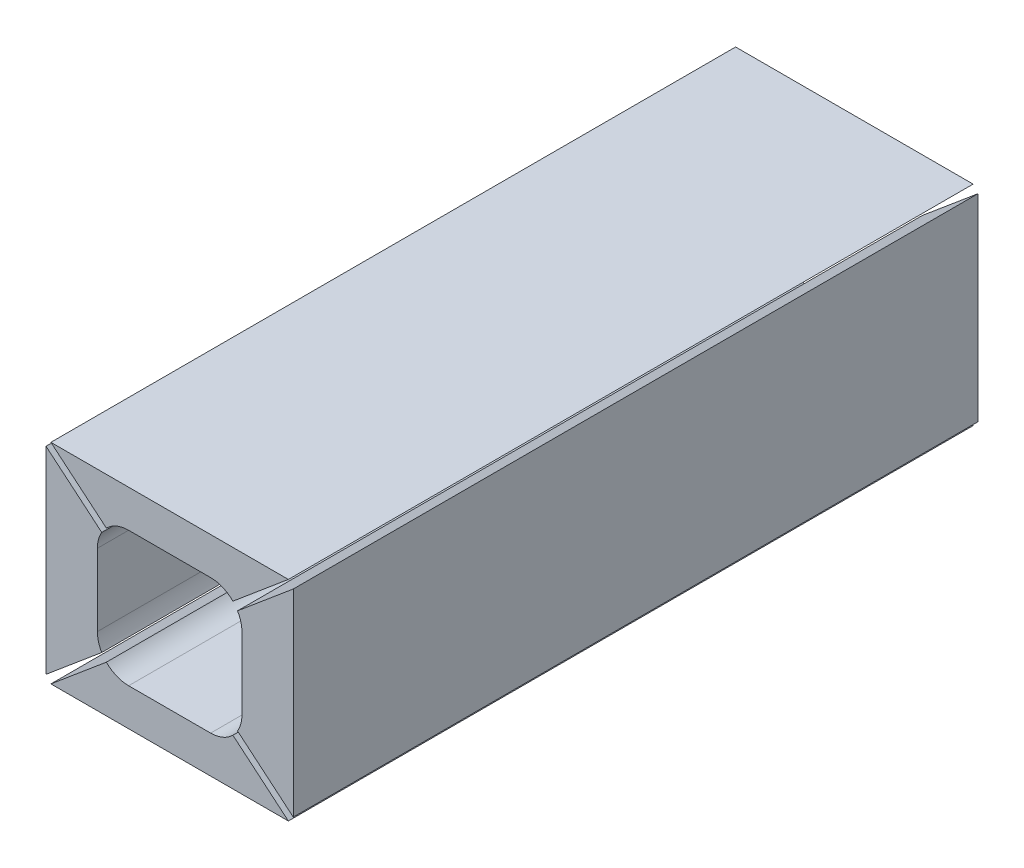
ISO-10303-21;
HEADER;
FILE_DESCRIPTION(('STEP AP214'),'2;1');
FILE_NAME('part.step','',(''),(''),'','','');
FILE_SCHEMA(('AUTOMOTIVE_DESIGN { 1 0 10303 214 1 1 1 1 }'));
ENDSEC;
DATA;
#1=APPLICATION_CONTEXT('core data for automotive mechanical design processes');
#2=APPLICATION_PROTOCOL_DEFINITION('international standard','automotive_design',2000,#1);
#3=PRODUCT_CONTEXT('',#1,'mechanical');
#4=PRODUCT('Part','Part','',(#3));
#5=PRODUCT_RELATED_PRODUCT_CATEGORY('part','',(#4));
#6=PRODUCT_DEFINITION_FORMATION('','',#4);
#7=PRODUCT_DEFINITION_CONTEXT('part definition',#1,'design');
#8=PRODUCT_DEFINITION('design','',#6,#7);
#9=PRODUCT_DEFINITION_SHAPE('','',#8);
#10=(LENGTH_UNIT() NAMED_UNIT(*) SI_UNIT(.MILLI.,.METRE.));
#11=(NAMED_UNIT(*) PLANE_ANGLE_UNIT() SI_UNIT($,.RADIAN.));
#12=(NAMED_UNIT(*) SI_UNIT($,.STERADIAN.) SOLID_ANGLE_UNIT());
#13=UNCERTAINTY_MEASURE_WITH_UNIT(LENGTH_MEASURE(1.E-05),#10,'distance_accuracy_value','');
#14=(GEOMETRIC_REPRESENTATION_CONTEXT(3) GLOBAL_UNCERTAINTY_ASSIGNED_CONTEXT((#13)) GLOBAL_UNIT_ASSIGNED_CONTEXT((#10,
#11,#12)) REPRESENTATION_CONTEXT('',''));
#15=CARTESIAN_POINT('',(0.,0.,0.));
#16=DIRECTION('',(0.,0.,1.));
#17=DIRECTION('',(1.,0.,0.));
#18=AXIS2_PLACEMENT_3D('',#15,#16,#17);
#19=CARTESIAN_POINT('',(10.78,-9.48,90.));
#20=DIRECTION('',(0.,0.,-1.));
#21=DIRECTION('',(-1.,0.,0.));
#22=AXIS2_PLACEMENT_3D('',#19,#20,#21);
#23=CYLINDRICAL_SURFACE('',#22,8.22);
#24=CARTESIAN_POINT('',(10.78,-9.48,-90.));
#25=DIRECTION('',(0.,0.,-1.));
#26=DIRECTION('',(1.,0.,0.));
#27=AXIS2_PLACEMENT_3D('',#24,#25,#26);
#28=CIRCLE('',#27,8.22);
#29=CARTESIAN_POINT('',(16.6272763873485,-15.257348773439,-90.));
#30=VERTEX_POINT('',#29);
#31=CARTESIAN_POINT('',(10.78,-17.7,-90.));
#32=VERTEX_POINT('',#31);
#33=EDGE_CURVE('E128',#30,#32,#28,.T.);
#34=ORIENTED_EDGE('',*,*,#33,.T.);
#35=DIRECTION('',(0.,0.,-1.));
#36=VECTOR('',#35,1.);
#37=CARTESIAN_POINT('',(10.78,-17.7,90.));
#38=LINE('',#37,#36);
#39=CARTESIAN_POINT('',(10.78,-17.7,90.));
#40=VERTEX_POINT('',#39);
#41=EDGE_CURVE('E12',#40,#32,#38,.T.);
#42=ORIENTED_EDGE('',*,*,#41,.F.);
#43=CARTESIAN_POINT('',(10.78,-9.48,90.));
#44=DIRECTION('',(0.,0.,-1.));
#45=DIRECTION('',(1.,0.,0.));
#46=AXIS2_PLACEMENT_3D('',#43,#44,#45);
#47=CIRCLE('',#46,8.22);
#48=CARTESIAN_POINT('',(16.6272763873485,-15.257348773439,90.));
#49=VERTEX_POINT('',#48);
#50=EDGE_CURVE('E138',#49,#40,#47,.T.);
#51=ORIENTED_EDGE('',*,*,#50,.F.);
#52=DIRECTION('',(0.,0.,-1.));
#53=VECTOR('',#52,1.);
#54=CARTESIAN_POINT('',(16.6272763873485,-15.257348773439,90.));
#55=LINE('',#54,#53);
#56=EDGE_CURVE('E124',#49,#30,#55,.T.);
#57=ORIENTED_EDGE('',*,*,#56,.T.);
#58=EDGE_LOOP('',(#34,#42,#51,#57));
#59=FACE_BOUND('',#58,.T.);
#60=ADVANCED_FACE('F44',(#59),#23,.F.);
#61=CARTESIAN_POINT('',(10.78,-17.7,90.));
#62=DIRECTION('',(0.,-1.,0.));
#63=DIRECTION('',(0.,0.,-1.));
#64=AXIS2_PLACEMENT_3D('',#61,#62,#63);
#65=PLANE('',#64);
#66=DIRECTION('',(-1.,0.,0.));
#67=VECTOR('',#66,1.);
#68=CARTESIAN_POINT('',(10.78,-17.7,-90.));
#69=LINE('',#68,#67);
#70=CARTESIAN_POINT('',(-10.78,-17.7,-90.));
#71=VERTEX_POINT('',#70);
#72=EDGE_CURVE('E131',#32,#71,#69,.T.);
#73=ORIENTED_EDGE('',*,*,#72,.T.);
#74=DIRECTION('',(0.,0.,-1.));
#75=VECTOR('',#74,1.);
#76=CARTESIAN_POINT('',(-10.78,-17.7,90.));
#77=LINE('',#76,#75);
#78=CARTESIAN_POINT('',(-10.78,-17.7,90.));
#79=VERTEX_POINT('',#78);
#80=EDGE_CURVE('E52',#79,#71,#77,.T.);
#81=ORIENTED_EDGE('',*,*,#80,.F.);
#82=DIRECTION('',(-1.,0.,0.));
#83=VECTOR('',#82,1.);
#84=CARTESIAN_POINT('',(10.78,-17.7,90.));
#85=LINE('',#84,#83);
#86=EDGE_CURVE('E97',#40,#79,#85,.T.);
#87=ORIENTED_EDGE('',*,*,#86,.F.);
#88=ORIENTED_EDGE('',*,*,#41,.T.);
#89=EDGE_LOOP('',(#73,#81,#87,#88));
#90=FACE_BOUND('',#89,.T.);
#91=ADVANCED_FACE('F162',(#90),#65,.F.);
#92=CARTESIAN_POINT('',(-10.78,-9.48,90.));
#93=DIRECTION('',(0.,0.,-1.));
#94=DIRECTION('',(-1.,0.,0.));
#95=AXIS2_PLACEMENT_3D('',#92,#93,#94);
#96=CYLINDRICAL_SURFACE('',#95,8.22);
#97=CARTESIAN_POINT('',(-10.78,-9.48,-90.));
#98=DIRECTION('',(0.,0.,-1.));
#99=DIRECTION('',(-1.,0.,0.));
#100=AXIS2_PLACEMENT_3D('',#97,#98,#99);
#101=CIRCLE('',#100,8.22);
#102=CARTESIAN_POINT('',(-16.6272763873484,-15.257348773439,-90.));
#103=VERTEX_POINT('',#102);
#104=EDGE_CURVE('E133',#71,#103,#101,.T.);
#105=ORIENTED_EDGE('',*,*,#104,.T.);
#106=DIRECTION('',(0.,0.,-1.));
#107=VECTOR('',#106,1.);
#108=CARTESIAN_POINT('',(-16.6272763873484,-15.257348773439,90.));
#109=LINE('',#108,#107);
#110=CARTESIAN_POINT('',(-16.6272763873484,-15.257348773439,90.));
#111=VERTEX_POINT('',#110);
#112=EDGE_CURVE('E119',#111,#103,#109,.T.);
#113=ORIENTED_EDGE('',*,*,#112,.F.);
#114=CARTESIAN_POINT('',(-10.78,-9.48,90.));
#115=DIRECTION('',(0.,0.,-1.));
#116=DIRECTION('',(-1.,0.,0.));
#117=AXIS2_PLACEMENT_3D('',#114,#115,#116);
#118=CIRCLE('',#117,8.22);
#119=EDGE_CURVE('E110',#79,#111,#118,.T.);
#120=ORIENTED_EDGE('',*,*,#119,.F.);
#121=ORIENTED_EDGE('',*,*,#80,.T.);
#122=EDGE_LOOP('',(#105,#113,#120,#121));
#123=FACE_BOUND('',#122,.T.);
#124=ADVANCED_FACE('F144',(#123),#96,.F.);
#125=CARTESIAN_POINT('',(-16.6272763873484,-15.257348773439,90.));
#126=DIRECTION('',(0.642787609686538,-0.766044443118979,0.));
#127=DIRECTION('',(0.766044443118979,0.642787609686538,0.));
#128=AXIS2_PLACEMENT_3D('',#125,#126,#127);
#129=PLANE('',#128);
#130=DIRECTION('',(-0.766044443118979,-0.642787609686538,0.));
#131=VECTOR('',#130,1.);
#132=CARTESIAN_POINT('',(-16.6272763873484,-15.257348773439,-90.));
#133=LINE('',#132,#131);
#134=CARTESIAN_POINT('',(-31.2174999694805,-27.5,-90.));
#135=VERTEX_POINT('',#134);
#136=EDGE_CURVE('E118',#103,#135,#133,.T.);
#137=ORIENTED_EDGE('',*,*,#136,.T.);
#138=DIRECTION('',(0.,0.,-1.));
#139=VECTOR('',#138,1.);
#140=CARTESIAN_POINT('',(-31.2174999694805,-27.5,90.));
#141=LINE('',#140,#139);
#142=CARTESIAN_POINT('',(-31.2174999694805,-27.5,90.));
#143=VERTEX_POINT('',#142);
#144=EDGE_CURVE('E115',#143,#135,#141,.T.);
#145=ORIENTED_EDGE('',*,*,#144,.F.);
#146=DIRECTION('',(-0.766044443118979,-0.642787609686538,0.));
#147=VECTOR('',#146,1.);
#148=CARTESIAN_POINT('',(-16.6272763873484,-15.257348773439,90.));
#149=LINE('',#148,#147);
#150=EDGE_CURVE('E104',#111,#143,#149,.T.);
#151=ORIENTED_EDGE('',*,*,#150,.F.);
#152=ORIENTED_EDGE('',*,*,#112,.T.);
#153=EDGE_LOOP('',(#137,#145,#151,#152));
#154=FACE_BOUND('',#153,.T.);
#155=ADVANCED_FACE('F116',(#154),#129,.F.);
#156=CARTESIAN_POINT('',(31.2174999694805,-27.5,90.));
#157=DIRECTION('',(0.,1.,0.));
#158=DIRECTION('',(-1.,0.,0.));
#159=AXIS2_PLACEMENT_3D('',#156,#157,#158);
#160=PLANE('',#159);
#161=DIRECTION('',(1.,0.,0.));
#162=VECTOR('',#161,1.);
#163=CARTESIAN_POINT('',(31.2174999694805,-27.5,-90.));
#164=LINE('',#163,#162);
#165=CARTESIAN_POINT('',(31.2174999694805,-27.5,-90.));
#166=VERTEX_POINT('',#165);
#167=EDGE_CURVE('E83',#135,#166,#164,.T.);
#168=ORIENTED_EDGE('',*,*,#167,.T.);
#169=DIRECTION('',(0.,0.,-1.));
#170=VECTOR('',#169,1.);
#171=CARTESIAN_POINT('',(31.2174999694805,-27.5,90.));
#172=LINE('',#171,#170);
#173=CARTESIAN_POINT('',(31.2174999694805,-27.5,90.));
#174=VERTEX_POINT('',#173);
#175=EDGE_CURVE('E120',#174,#166,#172,.T.);
#176=ORIENTED_EDGE('',*,*,#175,.F.);
#177=DIRECTION('',(1.,0.,0.));
#178=VECTOR('',#177,1.);
#179=CARTESIAN_POINT('',(31.2174999694805,-27.5,90.));
#180=LINE('',#179,#178);
#181=EDGE_CURVE('E108',#143,#174,#180,.T.);
#182=ORIENTED_EDGE('',*,*,#181,.F.);
#183=ORIENTED_EDGE('',*,*,#144,.T.);
#184=EDGE_LOOP('',(#168,#176,#182,#183));
#185=FACE_BOUND('',#184,.T.);
#186=ADVANCED_FACE('F122',(#185),#160,.F.);
#187=CARTESIAN_POINT('',(16.6272763873485,-15.257348773439,90.));
#188=DIRECTION('',(-0.642787609686538,-0.766044443118979,0.));
#189=DIRECTION('',(0.766044443118979,-0.642787609686538,0.));
#190=AXIS2_PLACEMENT_3D('',#187,#188,#189);
#191=PLANE('',#190);
#192=DIRECTION('',(-0.766044443118979,0.642787609686538,0.));
#193=VECTOR('',#192,1.);
#194=CARTESIAN_POINT('',(16.6272763873485,-15.257348773439,-90.));
#195=LINE('',#194,#193);
#196=EDGE_CURVE('E89',#166,#30,#195,.T.);
#197=ORIENTED_EDGE('',*,*,#196,.T.);
#198=ORIENTED_EDGE('',*,*,#56,.F.);
#199=DIRECTION('',(-0.766044443118979,0.642787609686538,0.));
#200=VECTOR('',#199,1.);
#201=CARTESIAN_POINT('',(16.6272763873485,-15.257348773439,90.));
#202=LINE('',#201,#200);
#203=EDGE_CURVE('E60',#174,#49,#202,.T.);
#204=ORIENTED_EDGE('',*,*,#203,.F.);
#205=ORIENTED_EDGE('',*,*,#175,.T.);
#206=EDGE_LOOP('',(#197,#198,#204,#205));
#207=FACE_BOUND('',#206,.T.);
#208=ADVANCED_FACE('F151',(#207),#191,.F.);
#209=CARTESIAN_POINT('',(10.78,-9.48,90.));
#210=DIRECTION('',(0.,0.,1.));
#211=DIRECTION('',(1.,0.,0.));
#212=AXIS2_PLACEMENT_3D('',#209,#210,#211);
#213=PLANE('',#212);
#214=ORIENTED_EDGE('',*,*,#50,.T.);
#215=ORIENTED_EDGE('',*,*,#86,.T.);
#216=ORIENTED_EDGE('',*,*,#119,.T.);
#217=ORIENTED_EDGE('',*,*,#150,.T.);
#218=ORIENTED_EDGE('',*,*,#181,.T.);
#219=ORIENTED_EDGE('',*,*,#203,.T.);
#220=EDGE_LOOP('',(#214,#215,#216,#217,#218,#219));
#221=FACE_BOUND('',#220,.T.);
#222=ADVANCED_FACE('F106',(#221),#213,.T.);
#223=CARTESIAN_POINT('',(10.78,-9.48,-90.));
#224=DIRECTION('',(0.,0.,1.));
#225=DIRECTION('',(1.,0.,0.));
#226=AXIS2_PLACEMENT_3D('',#223,#224,#225);
#227=PLANE('',#226);
#228=ORIENTED_EDGE('',*,*,#33,.F.);
#229=ORIENTED_EDGE('',*,*,#196,.F.);
#230=ORIENTED_EDGE('',*,*,#167,.F.);
#231=ORIENTED_EDGE('',*,*,#136,.F.);
#232=ORIENTED_EDGE('',*,*,#104,.F.);
#233=ORIENTED_EDGE('',*,*,#72,.F.);
#234=EDGE_LOOP('',(#228,#229,#230,#231,#232,#233));
#235=FACE_BOUND('',#234,.T.);
#236=ADVANCED_FACE('F147',(#235),#227,.F.);
#237=CLOSED_SHELL('',(#60,#91,#124,#155,#186,#208,#222,#236));
#238=MANIFOLD_SOLID_BREP('B2',#237);
#239=CARTESIAN_POINT('',(-17.8502959238137,-13.672769436745,90.));
#240=DIRECTION('',(-0.642787609686538,0.766044443118979,0.));
#241=DIRECTION('',(-0.766044443118979,-0.642787609686538,0.));
#242=AXIS2_PLACEMENT_3D('',#239,#240,#241);
#243=PLANE('',#242);
#244=DIRECTION('',(0.766044443118979,0.642787609686538,0.));
#245=VECTOR('',#244,1.);
#246=CARTESIAN_POINT('',(-17.8502959238137,-13.672769436745,-90.));
#247=LINE('',#246,#245);
#248=CARTESIAN_POINT('',(-32.5,-25.9653307239292,-90.));
#249=VERTEX_POINT('',#248);
#250=CARTESIAN_POINT('',(-17.8502959238137,-13.672769436745,-90.));
#251=VERTEX_POINT('',#250);
#252=EDGE_CURVE('E314',#249,#251,#247,.T.);
#253=ORIENTED_EDGE('',*,*,#252,.T.);
#254=DIRECTION('',(0.,0.,-1.));
#255=VECTOR('',#254,1.);
#256=CARTESIAN_POINT('',(-17.8502959238137,-13.672769436745,90.));
#257=LINE('',#256,#255);
#258=CARTESIAN_POINT('',(-17.8502959238137,-13.672769436745,90.));
#259=VERTEX_POINT('',#258);
#260=EDGE_CURVE('E42',#259,#251,#257,.T.);
#261=ORIENTED_EDGE('',*,*,#260,.F.);
#262=DIRECTION('',(0.766044443118979,0.642787609686538,0.));
#263=VECTOR('',#262,1.);
#264=CARTESIAN_POINT('',(-17.8502959238137,-13.672769436745,90.));
#265=LINE('',#264,#263);
#266=CARTESIAN_POINT('',(-32.5,-25.9653307239292,90.));
#267=VERTEX_POINT('',#266);
#268=EDGE_CURVE('E324',#267,#259,#265,.T.);
#269=ORIENTED_EDGE('',*,*,#268,.F.);
#270=DIRECTION('',(0.,0.,-1.));
#271=VECTOR('',#270,1.);
#272=CARTESIAN_POINT('',(-32.5,-25.9653307239292,90.));
#273=LINE('',#272,#271);
#274=EDGE_CURVE('E310',#267,#249,#273,.T.);
#275=ORIENTED_EDGE('',*,*,#274,.T.);
#276=EDGE_LOOP('',(#253,#261,#269,#275));
#277=FACE_BOUND('',#276,.T.);
#278=ADVANCED_FACE('F230',(#277),#243,.F.);
#279=CARTESIAN_POINT('',(-10.78,-9.48,90.));
#280=DIRECTION('',(0.,0.,-1.));
#281=DIRECTION('',(-1.,0.,0.));
#282=AXIS2_PLACEMENT_3D('',#279,#280,#281);
#283=CYLINDRICAL_SURFACE('',#282,8.22000000000001);
#284=CARTESIAN_POINT('',(-10.78,-9.48,-90.));
#285=DIRECTION('',(0.,0.,-1.));
#286=DIRECTION('',(-1.,0.,0.));
#287=AXIS2_PLACEMENT_3D('',#284,#285,#286);
#288=CIRCLE('',#287,8.22000000000001);
#289=CARTESIAN_POINT('',(-19.,-9.48,-90.));
#290=VERTEX_POINT('',#289);
#291=EDGE_CURVE('E317',#251,#290,#288,.T.);
#292=ORIENTED_EDGE('',*,*,#291,.T.);
#293=DIRECTION('',(0.,0.,-1.));
#294=VECTOR('',#293,1.);
#295=CARTESIAN_POINT('',(-19.,-9.48,90.));
#296=LINE('',#295,#294);
#297=CARTESIAN_POINT('',(-19.,-9.48,90.));
#298=VERTEX_POINT('',#297);
#299=EDGE_CURVE('E238',#298,#290,#296,.T.);
#300=ORIENTED_EDGE('',*,*,#299,.F.);
#301=CARTESIAN_POINT('',(-10.78,-9.48,90.));
#302=DIRECTION('',(0.,0.,-1.));
#303=DIRECTION('',(-1.,0.,0.));
#304=AXIS2_PLACEMENT_3D('',#301,#302,#303);
#305=CIRCLE('',#304,8.22000000000001);
#306=EDGE_CURVE('E283',#259,#298,#305,.T.);
#307=ORIENTED_EDGE('',*,*,#306,.F.);
#308=ORIENTED_EDGE('',*,*,#260,.T.);
#309=EDGE_LOOP('',(#292,#300,#307,#308));
#310=FACE_BOUND('',#309,.T.);
#311=ADVANCED_FACE('F348',(#310),#283,.F.);
#312=CARTESIAN_POINT('',(-19.,-9.48,90.));
#313=DIRECTION('',(-1.,0.,0.));
#314=DIRECTION('',(0.,0.,1.));
#315=AXIS2_PLACEMENT_3D('',#312,#313,#314);
#316=PLANE('',#315);
#317=DIRECTION('',(0.,1.,0.));
#318=VECTOR('',#317,1.);
#319=CARTESIAN_POINT('',(-19.,-9.48,-90.));
#320=LINE('',#319,#318);
#321=CARTESIAN_POINT('',(-19.,9.48,-90.));
#322=VERTEX_POINT('',#321);
#323=EDGE_CURVE('E319',#290,#322,#320,.T.);
#324=ORIENTED_EDGE('',*,*,#323,.T.);
#325=DIRECTION('',(0.,0.,-1.));
#326=VECTOR('',#325,1.);
#327=CARTESIAN_POINT('',(-19.,9.48,90.));
#328=LINE('',#327,#326);
#329=CARTESIAN_POINT('',(-19.,9.48,90.));
#330=VERTEX_POINT('',#329);
#331=EDGE_CURVE('E305',#330,#322,#328,.T.);
#332=ORIENTED_EDGE('',*,*,#331,.F.);
#333=DIRECTION('',(0.,1.,0.));
#334=VECTOR('',#333,1.);
#335=CARTESIAN_POINT('',(-19.,-9.48,90.));
#336=LINE('',#335,#334);
#337=EDGE_CURVE('E296',#298,#330,#336,.T.);
#338=ORIENTED_EDGE('',*,*,#337,.F.);
#339=ORIENTED_EDGE('',*,*,#299,.T.);
#340=EDGE_LOOP('',(#324,#332,#338,#339));
#341=FACE_BOUND('',#340,.T.);
#342=ADVANCED_FACE('F330',(#341),#316,.F.);
#343=CARTESIAN_POINT('',(-10.78,9.48,90.));
#344=DIRECTION('',(0.,0.,-1.));
#345=DIRECTION('',(-1.,0.,0.));
#346=AXIS2_PLACEMENT_3D('',#343,#344,#345);
#347=CYLINDRICAL_SURFACE('',#346,8.22);
#348=CARTESIAN_POINT('',(-10.78,9.48,-90.));
#349=DIRECTION('',(0.,0.,-1.));
#350=DIRECTION('',(1.,0.,0.));
#351=AXIS2_PLACEMENT_3D('',#348,#349,#350);
#352=CIRCLE('',#351,8.22);
#353=CARTESIAN_POINT('',(-17.8502959238137,13.672769436745,-90.));
#354=VERTEX_POINT('',#353);
#355=EDGE_CURVE('E304',#322,#354,#352,.T.);
#356=ORIENTED_EDGE('',*,*,#355,.T.);
#357=DIRECTION('',(0.,0.,-1.));
#358=VECTOR('',#357,1.);
#359=CARTESIAN_POINT('',(-17.8502959238137,13.672769436745,90.));
#360=LINE('',#359,#358);
#361=CARTESIAN_POINT('',(-17.8502959238137,13.672769436745,90.));
#362=VERTEX_POINT('',#361);
#363=EDGE_CURVE('E301',#362,#354,#360,.T.);
#364=ORIENTED_EDGE('',*,*,#363,.F.);
#365=CARTESIAN_POINT('',(-10.78,9.48,90.));
#366=DIRECTION('',(0.,0.,-1.));
#367=DIRECTION('',(1.,0.,0.));
#368=AXIS2_PLACEMENT_3D('',#365,#366,#367);
#369=CIRCLE('',#368,8.22);
#370=EDGE_CURVE('E290',#330,#362,#369,.T.);
#371=ORIENTED_EDGE('',*,*,#370,.F.);
#372=ORIENTED_EDGE('',*,*,#331,.T.);
#373=EDGE_LOOP('',(#356,#364,#371,#372));
#374=FACE_BOUND('',#373,.T.);
#375=ADVANCED_FACE('F302',(#374),#347,.F.);
#376=CARTESIAN_POINT('',(-17.8502959238137,13.672769436745,90.));
#377=DIRECTION('',(-0.642787609686538,-0.766044443118979,0.));
#378=DIRECTION('',(0.766044443118979,-0.642787609686538,0.));
#379=AXIS2_PLACEMENT_3D('',#376,#377,#378);
#380=PLANE('',#379);
#381=DIRECTION('',(-0.766044443118979,0.642787609686538,0.));
#382=VECTOR('',#381,1.);
#383=CARTESIAN_POINT('',(-17.8502959238137,13.672769436745,-90.));
#384=LINE('',#383,#382);
#385=CARTESIAN_POINT('',(-32.5,25.9653307239292,-90.));
#386=VERTEX_POINT('',#385);
#387=EDGE_CURVE('E269',#354,#386,#384,.T.);
#388=ORIENTED_EDGE('',*,*,#387,.T.);
#389=DIRECTION('',(0.,0.,-1.));
#390=VECTOR('',#389,1.);
#391=CARTESIAN_POINT('',(-32.5,25.9653307239292,90.));
#392=LINE('',#391,#390);
#393=CARTESIAN_POINT('',(-32.5,25.9653307239292,90.));
#394=VERTEX_POINT('',#393);
#395=EDGE_CURVE('E306',#394,#386,#392,.T.);
#396=ORIENTED_EDGE('',*,*,#395,.F.);
#397=DIRECTION('',(-0.766044443118979,0.642787609686538,0.));
#398=VECTOR('',#397,1.);
#399=CARTESIAN_POINT('',(-17.8502959238137,13.672769436745,90.));
#400=LINE('',#399,#398);
#401=EDGE_CURVE('E294',#362,#394,#400,.T.);
#402=ORIENTED_EDGE('',*,*,#401,.F.);
#403=ORIENTED_EDGE('',*,*,#363,.T.);
#404=EDGE_LOOP('',(#388,#396,#402,#403));
#405=FACE_BOUND('',#404,.T.);
#406=ADVANCED_FACE('F308',(#405),#380,.F.);
#407=CARTESIAN_POINT('',(-32.5,-25.9653307239292,90.));
#408=DIRECTION('',(1.,0.,0.));
#409=DIRECTION('',(0.,0.,-1.));
#410=AXIS2_PLACEMENT_3D('',#407,#408,#409);
#411=PLANE('',#410);
#412=DIRECTION('',(0.,-1.,0.));
#413=VECTOR('',#412,1.);
#414=CARTESIAN_POINT('',(-32.5,-25.9653307239292,-90.));
#415=LINE('',#414,#413);
#416=EDGE_CURVE('E275',#386,#249,#415,.T.);
#417=ORIENTED_EDGE('',*,*,#416,.T.);
#418=ORIENTED_EDGE('',*,*,#274,.F.);
#419=DIRECTION('',(0.,-1.,0.));
#420=VECTOR('',#419,1.);
#421=CARTESIAN_POINT('',(-32.5,-25.9653307239292,90.));
#422=LINE('',#421,#420);
#423=EDGE_CURVE('E246',#394,#267,#422,.T.);
#424=ORIENTED_EDGE('',*,*,#423,.F.);
#425=ORIENTED_EDGE('',*,*,#395,.T.);
#426=EDGE_LOOP('',(#417,#418,#424,#425));
#427=FACE_BOUND('',#426,.T.);
#428=ADVANCED_FACE('F337',(#427),#411,.F.);
#429=CARTESIAN_POINT('',(-10.78,9.48,90.));
#430=DIRECTION('',(0.,0.,1.));
#431=DIRECTION('',(1.,0.,0.));
#432=AXIS2_PLACEMENT_3D('',#429,#430,#431);
#433=PLANE('',#432);
#434=ORIENTED_EDGE('',*,*,#268,.T.);
#435=ORIENTED_EDGE('',*,*,#306,.T.);
#436=ORIENTED_EDGE('',*,*,#337,.T.);
#437=ORIENTED_EDGE('',*,*,#370,.T.);
#438=ORIENTED_EDGE('',*,*,#401,.T.);
#439=ORIENTED_EDGE('',*,*,#423,.T.);
#440=EDGE_LOOP('',(#434,#435,#436,#437,#438,#439));
#441=FACE_BOUND('',#440,.T.);
#442=ADVANCED_FACE('F292',(#441),#433,.T.);
#443=CARTESIAN_POINT('',(-10.78,9.48,-90.));
#444=DIRECTION('',(0.,0.,1.));
#445=DIRECTION('',(1.,0.,0.));
#446=AXIS2_PLACEMENT_3D('',#443,#444,#445);
#447=PLANE('',#446);
#448=ORIENTED_EDGE('',*,*,#252,.F.);
#449=ORIENTED_EDGE('',*,*,#416,.F.);
#450=ORIENTED_EDGE('',*,*,#387,.F.);
#451=ORIENTED_EDGE('',*,*,#355,.F.);
#452=ORIENTED_EDGE('',*,*,#323,.F.);
#453=ORIENTED_EDGE('',*,*,#291,.F.);
#454=EDGE_LOOP('',(#448,#449,#450,#451,#452,#453));
#455=FACE_BOUND('',#454,.T.);
#456=ADVANCED_FACE('F333',(#455),#447,.F.);
#457=CLOSED_SHELL('',(#278,#311,#342,#375,#406,#428,#442,#456));
#458=MANIFOLD_SOLID_BREP('B6',#457);
#459=CARTESIAN_POINT('',(10.78,9.48,90.));
#460=DIRECTION('',(0.,0.,-1.));
#461=DIRECTION('',(-1.,0.,0.));
#462=AXIS2_PLACEMENT_3D('',#459,#460,#461);
#463=CYLINDRICAL_SURFACE('',#462,8.22);
#464=CARTESIAN_POINT('',(10.78,9.48,-90.));
#465=DIRECTION('',(0.,0.,-1.));
#466=DIRECTION('',(-1.,0.,0.));
#467=AXIS2_PLACEMENT_3D('',#464,#465,#466);
#468=CIRCLE('',#467,8.22);
#469=CARTESIAN_POINT('',(17.8502959238137,13.672769436745,-90.));
#470=VERTEX_POINT('',#469);
#471=CARTESIAN_POINT('',(19.,9.48,-90.));
#472=VERTEX_POINT('',#471);
#473=EDGE_CURVE('E499',#470,#472,#468,.T.);
#474=ORIENTED_EDGE('',*,*,#473,.T.);
#475=DIRECTION('',(0.,0.,-1.));
#476=VECTOR('',#475,1.);
#477=CARTESIAN_POINT('',(19.,9.48,90.));
#478=LINE('',#477,#476);
#479=CARTESIAN_POINT('',(19.,9.48,90.));
#480=VERTEX_POINT('',#479);
#481=EDGE_CURVE('E228',#480,#472,#478,.T.);
#482=ORIENTED_EDGE('',*,*,#481,.F.);
#483=CARTESIAN_POINT('',(10.78,9.48,90.));
#484=DIRECTION('',(0.,0.,-1.));
#485=DIRECTION('',(-1.,0.,0.));
#486=AXIS2_PLACEMENT_3D('',#483,#484,#485);
#487=CIRCLE('',#486,8.22);
#488=CARTESIAN_POINT('',(17.8502959238137,13.672769436745,90.));
#489=VERTEX_POINT('',#488);
#490=EDGE_CURVE('E509',#489,#480,#487,.T.);
#491=ORIENTED_EDGE('',*,*,#490,.F.);
#492=DIRECTION('',(0.,0.,-1.));
#493=VECTOR('',#492,1.);
#494=CARTESIAN_POINT('',(17.8502959238137,13.672769436745,90.));
#495=LINE('',#494,#493);
#496=EDGE_CURVE('E495',#489,#470,#495,.T.);
#497=ORIENTED_EDGE('',*,*,#496,.T.);
#498=EDGE_LOOP('',(#474,#482,#491,#497));
#499=FACE_BOUND('',#498,.T.);
#500=ADVANCED_FACE('F415',(#499),#463,.F.);
#501=CARTESIAN_POINT('',(19.,-9.48,90.));
#502=DIRECTION('',(1.,0.,0.));
#503=DIRECTION('',(0.,0.,-1.));
#504=AXIS2_PLACEMENT_3D('',#501,#502,#503);
#505=PLANE('',#504);
#506=DIRECTION('',(0.,-1.,0.));
#507=VECTOR('',#506,1.);
#508=CARTESIAN_POINT('',(19.,-9.48,-90.));
#509=LINE('',#508,#507);
#510=CARTESIAN_POINT('',(19.,-9.48,-90.));
#511=VERTEX_POINT('',#510);
#512=EDGE_CURVE('E502',#472,#511,#509,.T.);
#513=ORIENTED_EDGE('',*,*,#512,.T.);
#514=DIRECTION('',(0.,0.,-1.));
#515=VECTOR('',#514,1.);
#516=CARTESIAN_POINT('',(19.,-9.48,90.));
#517=LINE('',#516,#515);
#518=CARTESIAN_POINT('',(19.,-9.48,90.));
#519=VERTEX_POINT('',#518);
#520=EDGE_CURVE('E423',#519,#511,#517,.T.);
#521=ORIENTED_EDGE('',*,*,#520,.F.);
#522=DIRECTION('',(0.,-1.,0.));
#523=VECTOR('',#522,1.);
#524=CARTESIAN_POINT('',(19.,-9.48,90.));
#525=LINE('',#524,#523);
#526=EDGE_CURVE('E468',#480,#519,#525,.T.);
#527=ORIENTED_EDGE('',*,*,#526,.F.);
#528=ORIENTED_EDGE('',*,*,#481,.T.);
#529=EDGE_LOOP('',(#513,#521,#527,#528));
#530=FACE_BOUND('',#529,.T.);
#531=ADVANCED_FACE('F533',(#530),#505,.F.);
#532=CARTESIAN_POINT('',(10.78,-9.48,90.));
#533=DIRECTION('',(0.,0.,-1.));
#534=DIRECTION('',(-1.,0.,0.));
#535=AXIS2_PLACEMENT_3D('',#532,#533,#534);
#536=CYLINDRICAL_SURFACE('',#535,8.22);
#537=CARTESIAN_POINT('',(10.78,-9.48,-90.));
#538=DIRECTION('',(0.,0.,-1.));
#539=DIRECTION('',(1.,0.,0.));
#540=AXIS2_PLACEMENT_3D('',#537,#538,#539);
#541=CIRCLE('',#540,8.22);
#542=CARTESIAN_POINT('',(17.8502959238137,-13.672769436745,-90.));
#543=VERTEX_POINT('',#542);
#544=EDGE_CURVE('E504',#511,#543,#541,.T.);
#545=ORIENTED_EDGE('',*,*,#544,.T.);
#546=DIRECTION('',(0.,0.,-1.));
#547=VECTOR('',#546,1.);
#548=CARTESIAN_POINT('',(17.8502959238137,-13.672769436745,90.));
#549=LINE('',#548,#547);
#550=CARTESIAN_POINT('',(17.8502959238137,-13.672769436745,90.));
#551=VERTEX_POINT('',#550);
#552=EDGE_CURVE('E490',#551,#543,#549,.T.);
#553=ORIENTED_EDGE('',*,*,#552,.F.);
#554=CARTESIAN_POINT('',(10.78,-9.48,90.));
#555=DIRECTION('',(0.,0.,-1.));
#556=DIRECTION('',(1.,0.,0.));
#557=AXIS2_PLACEMENT_3D('',#554,#555,#556);
#558=CIRCLE('',#557,8.22);
#559=EDGE_CURVE('E481',#519,#551,#558,.T.);
#560=ORIENTED_EDGE('',*,*,#559,.F.);
#561=ORIENTED_EDGE('',*,*,#520,.T.);
#562=EDGE_LOOP('',(#545,#553,#560,#561));
#563=FACE_BOUND('',#562,.T.);
#564=ADVANCED_FACE('F515',(#563),#536,.F.);
#565=CARTESIAN_POINT('',(17.8502959238137,-13.672769436745,90.));
#566=DIRECTION('',(0.642787609686538,0.766044443118979,0.));
#567=DIRECTION('',(-0.766044443118979,0.642787609686538,0.));
#568=AXIS2_PLACEMENT_3D('',#565,#566,#567);
#569=PLANE('',#568);
#570=DIRECTION('',(0.766044443118979,-0.642787609686538,0.));
#571=VECTOR('',#570,1.);
#572=CARTESIAN_POINT('',(17.8502959238137,-13.672769436745,-90.));
#573=LINE('',#572,#571);
#574=CARTESIAN_POINT('',(32.5,-25.9653307239292,-90.));
#575=VERTEX_POINT('',#574);
#576=EDGE_CURVE('E489',#543,#575,#573,.T.);
#577=ORIENTED_EDGE('',*,*,#576,.T.);
#578=DIRECTION('',(0.,0.,-1.));
#579=VECTOR('',#578,1.);
#580=CARTESIAN_POINT('',(32.5,-25.9653307239292,90.));
#581=LINE('',#580,#579);
#582=CARTESIAN_POINT('',(32.5,-25.9653307239292,90.));
#583=VERTEX_POINT('',#582);
#584=EDGE_CURVE('E486',#583,#575,#581,.T.);
#585=ORIENTED_EDGE('',*,*,#584,.F.);
#586=DIRECTION('',(0.766044443118979,-0.642787609686538,0.));
#587=VECTOR('',#586,1.);
#588=CARTESIAN_POINT('',(17.8502959238137,-13.672769436745,90.));
#589=LINE('',#588,#587);
#590=EDGE_CURVE('E475',#551,#583,#589,.T.);
#591=ORIENTED_EDGE('',*,*,#590,.F.);
#592=ORIENTED_EDGE('',*,*,#552,.T.);
#593=EDGE_LOOP('',(#577,#585,#591,#592));
#594=FACE_BOUND('',#593,.T.);
#595=ADVANCED_FACE('F487',(#594),#569,.F.);
#596=CARTESIAN_POINT('',(32.5,-25.9653307239292,90.));
#597=DIRECTION('',(-1.,0.,0.));
#598=DIRECTION('',(0.,0.,1.));
#599=AXIS2_PLACEMENT_3D('',#596,#597,#598);
#600=PLANE('',#599);
#601=DIRECTION('',(0.,1.,0.));
#602=VECTOR('',#601,1.);
#603=CARTESIAN_POINT('',(32.5,-25.9653307239292,-90.));
#604=LINE('',#603,#602);
#605=CARTESIAN_POINT('',(32.5,25.9653307239292,-90.));
#606=VERTEX_POINT('',#605);
#607=EDGE_CURVE('E454',#575,#606,#604,.T.);
#608=ORIENTED_EDGE('',*,*,#607,.T.);
#609=DIRECTION('',(0.,0.,-1.));
#610=VECTOR('',#609,1.);
#611=CARTESIAN_POINT('',(32.5,25.9653307239292,90.));
#612=LINE('',#611,#610);
#613=CARTESIAN_POINT('',(32.5,25.9653307239292,90.));
#614=VERTEX_POINT('',#613);
#615=EDGE_CURVE('E491',#614,#606,#612,.T.);
#616=ORIENTED_EDGE('',*,*,#615,.F.);
#617=DIRECTION('',(0.,1.,0.));
#618=VECTOR('',#617,1.);
#619=CARTESIAN_POINT('',(32.5,-25.9653307239292,90.));
#620=LINE('',#619,#618);
#621=EDGE_CURVE('E479',#583,#614,#620,.T.);
#622=ORIENTED_EDGE('',*,*,#621,.F.);
#623=ORIENTED_EDGE('',*,*,#584,.T.);
#624=EDGE_LOOP('',(#608,#616,#622,#623));
#625=FACE_BOUND('',#624,.T.);
#626=ADVANCED_FACE('F493',(#625),#600,.F.);
#627=CARTESIAN_POINT('',(17.8502959238137,13.672769436745,90.));
#628=DIRECTION('',(0.642787609686538,-0.766044443118979,0.));
#629=DIRECTION('',(0.766044443118979,0.642787609686538,0.));
#630=AXIS2_PLACEMENT_3D('',#627,#628,#629);
#631=PLANE('',#630);
#632=DIRECTION('',(-0.766044443118979,-0.642787609686538,0.));
#633=VECTOR('',#632,1.);
#634=CARTESIAN_POINT('',(17.8502959238137,13.672769436745,-90.));
#635=LINE('',#634,#633);
#636=EDGE_CURVE('E460',#606,#470,#635,.T.);
#637=ORIENTED_EDGE('',*,*,#636,.T.);
#638=ORIENTED_EDGE('',*,*,#496,.F.);
#639=DIRECTION('',(-0.766044443118979,-0.642787609686538,0.));
#640=VECTOR('',#639,1.);
#641=CARTESIAN_POINT('',(17.8502959238137,13.672769436745,90.));
#642=LINE('',#641,#640);
#643=EDGE_CURVE('E431',#614,#489,#642,.T.);
#644=ORIENTED_EDGE('',*,*,#643,.F.);
#645=ORIENTED_EDGE('',*,*,#615,.T.);
#646=EDGE_LOOP('',(#637,#638,#644,#645));
#647=FACE_BOUND('',#646,.T.);
#648=ADVANCED_FACE('F522',(#647),#631,.F.);
#649=CARTESIAN_POINT('',(10.78,9.48,90.));
#650=DIRECTION('',(0.,0.,-1.));
#651=DIRECTION('',(-1.,0.,0.));
#652=AXIS2_PLACEMENT_3D('',#649,#650,#651);
#653=PLANE('',#652);
#654=ORIENTED_EDGE('',*,*,#490,.T.);
#655=ORIENTED_EDGE('',*,*,#526,.T.);
#656=ORIENTED_EDGE('',*,*,#559,.T.);
#657=ORIENTED_EDGE('',*,*,#590,.T.);
#658=ORIENTED_EDGE('',*,*,#621,.T.);
#659=ORIENTED_EDGE('',*,*,#643,.T.);
#660=EDGE_LOOP('',(#654,#655,#656,#657,#658,#659));
#661=FACE_BOUND('',#660,.T.);
#662=ADVANCED_FACE('F477',(#661),#653,.F.);
#663=CARTESIAN_POINT('',(10.78,9.48,-90.));
#664=DIRECTION('',(0.,0.,-1.));
#665=DIRECTION('',(-1.,0.,0.));
#666=AXIS2_PLACEMENT_3D('',#663,#664,#665);
#667=PLANE('',#666);
#668=ORIENTED_EDGE('',*,*,#473,.F.);
#669=ORIENTED_EDGE('',*,*,#636,.F.);
#670=ORIENTED_EDGE('',*,*,#607,.F.);
#671=ORIENTED_EDGE('',*,*,#576,.F.);
#672=ORIENTED_EDGE('',*,*,#544,.F.);
#673=ORIENTED_EDGE('',*,*,#512,.F.);
#674=EDGE_LOOP('',(#668,#669,#670,#671,#672,#673));
#675=FACE_BOUND('',#674,.T.);
#676=ADVANCED_FACE('F518',(#675),#667,.T.);
#677=CLOSED_SHELL('',(#500,#531,#564,#595,#626,#648,#662,#676));
#678=MANIFOLD_SOLID_BREP('B36',#677);
#679=CARTESIAN_POINT('',(10.78,9.48,90.));
#680=DIRECTION('',(0.,0.,-1.));
#681=DIRECTION('',(-1.,0.,0.));
#682=AXIS2_PLACEMENT_3D('',#679,#680,#681);
#683=CYLINDRICAL_SURFACE('',#682,8.22);
#684=CARTESIAN_POINT('',(10.78,9.48,-90.));
#685=DIRECTION('',(0.,0.,-1.));
#686=DIRECTION('',(-1.,0.,0.));
#687=AXIS2_PLACEMENT_3D('',#684,#685,#686);
#688=CIRCLE('',#687,8.22);
#689=CARTESIAN_POINT('',(10.78,17.7,-90.));
#690=VERTEX_POINT('',#689);
#691=CARTESIAN_POINT('',(16.6272763873484,15.257348773439,-90.));
#692=VERTEX_POINT('',#691);
#693=EDGE_CURVE('E675',#690,#692,#688,.T.);
#694=ORIENTED_EDGE('',*,*,#693,.T.);
#695=DIRECTION('',(0.,0.,-1.));
#696=VECTOR('',#695,1.);
#697=CARTESIAN_POINT('',(16.6272763873484,15.257348773439,90.));
#698=LINE('',#697,#696);
#699=CARTESIAN_POINT('',(16.6272763873484,15.257348773439,90.));
#700=VERTEX_POINT('',#699);
#701=EDGE_CURVE('E413',#700,#692,#698,.T.);
#702=ORIENTED_EDGE('',*,*,#701,.F.);
#703=CARTESIAN_POINT('',(10.78,9.48,90.));
#704=DIRECTION('',(0.,0.,-1.));
#705=DIRECTION('',(-1.,0.,0.));
#706=AXIS2_PLACEMENT_3D('',#703,#704,#705);
#707=CIRCLE('',#706,8.22);
#708=CARTESIAN_POINT('',(10.78,17.7,90.));
#709=VERTEX_POINT('',#708);
#710=EDGE_CURVE('E685',#709,#700,#707,.T.);
#711=ORIENTED_EDGE('',*,*,#710,.F.);
#712=DIRECTION('',(0.,0.,-1.));
#713=VECTOR('',#712,1.);
#714=CARTESIAN_POINT('',(10.78,17.7,90.));
#715=LINE('',#714,#713);
#716=EDGE_CURVE('E671',#709,#690,#715,.T.);
#717=ORIENTED_EDGE('',*,*,#716,.T.);
#718=EDGE_LOOP('',(#694,#702,#711,#717));
#719=FACE_BOUND('',#718,.T.);
#720=ADVANCED_FACE('F591',(#719),#683,.F.);
#721=CARTESIAN_POINT('',(16.6272763873484,15.257348773439,90.));
#722=DIRECTION('',(-0.642787609686538,0.766044443118979,0.));
#723=DIRECTION('',(-0.766044443118979,-0.642787609686538,0.));
#724=AXIS2_PLACEMENT_3D('',#721,#722,#723);
#725=PLANE('',#724);
#726=DIRECTION('',(0.766044443118979,0.642787609686538,0.));
#727=VECTOR('',#726,1.);
#728=CARTESIAN_POINT('',(16.6272763873484,15.257348773439,-90.));
#729=LINE('',#728,#727);
#730=CARTESIAN_POINT('',(31.2174999694805,27.5,-90.));
#731=VERTEX_POINT('',#730);
#732=EDGE_CURVE('E678',#692,#731,#729,.T.);
#733=ORIENTED_EDGE('',*,*,#732,.T.);
#734=DIRECTION('',(0.,0.,-1.));
#735=VECTOR('',#734,1.);
#736=CARTESIAN_POINT('',(31.2174999694805,27.5,90.));
#737=LINE('',#736,#735);
#738=CARTESIAN_POINT('',(31.2174999694805,27.5,90.));
#739=VERTEX_POINT('',#738);
#740=EDGE_CURVE('E599',#739,#731,#737,.T.);
#741=ORIENTED_EDGE('',*,*,#740,.F.);
#742=DIRECTION('',(0.766044443118979,0.642787609686538,0.));
#743=VECTOR('',#742,1.);
#744=CARTESIAN_POINT('',(16.6272763873484,15.257348773439,90.));
#745=LINE('',#744,#743);
#746=EDGE_CURVE('E644',#700,#739,#745,.T.);
#747=ORIENTED_EDGE('',*,*,#746,.F.);
#748=ORIENTED_EDGE('',*,*,#701,.T.);
#749=EDGE_LOOP('',(#733,#741,#747,#748));
#750=FACE_BOUND('',#749,.T.);
#751=ADVANCED_FACE('F709',(#750),#725,.F.);
#752=CARTESIAN_POINT('',(31.2174999694805,27.5,90.));
#753=DIRECTION('',(0.,-1.,0.));
#754=DIRECTION('',(0.,0.,-1.));
#755=AXIS2_PLACEMENT_3D('',#752,#753,#754);
#756=PLANE('',#755);
#757=DIRECTION('',(-1.,0.,0.));
#758=VECTOR('',#757,1.);
#759=CARTESIAN_POINT('',(31.2174999694805,27.5,-90.));
#760=LINE('',#759,#758);
#761=CARTESIAN_POINT('',(-31.2174999694805,27.5,-90.));
#762=VERTEX_POINT('',#761);
#763=EDGE_CURVE('E680',#731,#762,#760,.T.);
#764=ORIENTED_EDGE('',*,*,#763,.T.);
#765=DIRECTION('',(0.,0.,-1.));
#766=VECTOR('',#765,1.);
#767=CARTESIAN_POINT('',(-31.2174999694805,27.5,90.));
#768=LINE('',#767,#766);
#769=CARTESIAN_POINT('',(-31.2174999694805,27.5,90.));
#770=VERTEX_POINT('',#769);
#771=EDGE_CURVE('E666',#770,#762,#768,.T.);
#772=ORIENTED_EDGE('',*,*,#771,.F.);
#773=DIRECTION('',(-1.,0.,0.));
#774=VECTOR('',#773,1.);
#775=CARTESIAN_POINT('',(31.2174999694805,27.5,90.));
#776=LINE('',#775,#774);
#777=EDGE_CURVE('E657',#739,#770,#776,.T.);
#778=ORIENTED_EDGE('',*,*,#777,.F.);
#779=ORIENTED_EDGE('',*,*,#740,.T.);
#780=EDGE_LOOP('',(#764,#772,#778,#779));
#781=FACE_BOUND('',#780,.T.);
#782=ADVANCED_FACE('F691',(#781),#756,.F.);
#783=CARTESIAN_POINT('',(-16.6272763873484,15.257348773439,90.));
#784=DIRECTION('',(0.642787609686538,0.766044443118979,0.));
#785=DIRECTION('',(-0.766044443118979,0.642787609686538,0.));
#786=AXIS2_PLACEMENT_3D('',#783,#784,#785);
#787=PLANE('',#786);
#788=DIRECTION('',(0.766044443118979,-0.642787609686538,0.));
#789=VECTOR('',#788,1.);
#790=CARTESIAN_POINT('',(-16.6272763873484,15.257348773439,-90.));
#791=LINE('',#790,#789);
#792=CARTESIAN_POINT('',(-16.6272763873484,15.257348773439,-90.));
#793=VERTEX_POINT('',#792);
#794=EDGE_CURVE('E665',#762,#793,#791,.T.);
#795=ORIENTED_EDGE('',*,*,#794,.T.);
#796=DIRECTION('',(0.,0.,-1.));
#797=VECTOR('',#796,1.);
#798=CARTESIAN_POINT('',(-16.6272763873484,15.257348773439,90.));
#799=LINE('',#798,#797);
#800=CARTESIAN_POINT('',(-16.6272763873484,15.257348773439,90.));
#801=VERTEX_POINT('',#800);
#802=EDGE_CURVE('E662',#801,#793,#799,.T.);
#803=ORIENTED_EDGE('',*,*,#802,.F.);
#804=DIRECTION('',(0.766044443118979,-0.642787609686538,0.));
#805=VECTOR('',#804,1.);
#806=CARTESIAN_POINT('',(-16.6272763873484,15.257348773439,90.));
#807=LINE('',#806,#805);
#808=EDGE_CURVE('E651',#770,#801,#807,.T.);
#809=ORIENTED_EDGE('',*,*,#808,.F.);
#810=ORIENTED_EDGE('',*,*,#771,.T.);
#811=EDGE_LOOP('',(#795,#803,#809,#810));
#812=FACE_BOUND('',#811,.T.);
#813=ADVANCED_FACE('F663',(#812),#787,.F.);
#814=CARTESIAN_POINT('',(-10.78,9.48,90.));
#815=DIRECTION('',(0.,0.,-1.));
#816=DIRECTION('',(-1.,0.,0.));
#817=AXIS2_PLACEMENT_3D('',#814,#815,#816);
#818=CYLINDRICAL_SURFACE('',#817,8.22);
#819=CARTESIAN_POINT('',(-10.78,9.48,-90.));
#820=DIRECTION('',(0.,0.,-1.));
#821=DIRECTION('',(1.,0.,0.));
#822=AXIS2_PLACEMENT_3D('',#819,#820,#821);
#823=CIRCLE('',#822,8.22);
#824=CARTESIAN_POINT('',(-10.78,17.7,-90.));
#825=VERTEX_POINT('',#824);
#826=EDGE_CURVE('E630',#793,#825,#823,.T.);
#827=ORIENTED_EDGE('',*,*,#826,.T.);
#828=DIRECTION('',(0.,0.,-1.));
#829=VECTOR('',#828,1.);
#830=CARTESIAN_POINT('',(-10.78,17.7,90.));
#831=LINE('',#830,#829);
#832=CARTESIAN_POINT('',(-10.78,17.7,90.));
#833=VERTEX_POINT('',#832);
#834=EDGE_CURVE('E667',#833,#825,#831,.T.);
#835=ORIENTED_EDGE('',*,*,#834,.F.);
#836=CARTESIAN_POINT('',(-10.78,9.48,90.));
#837=DIRECTION('',(0.,0.,-1.));
#838=DIRECTION('',(1.,0.,0.));
#839=AXIS2_PLACEMENT_3D('',#836,#837,#838);
#840=CIRCLE('',#839,8.22);
#841=EDGE_CURVE('E655',#801,#833,#840,.T.);
#842=ORIENTED_EDGE('',*,*,#841,.F.);
#843=ORIENTED_EDGE('',*,*,#802,.T.);
#844=EDGE_LOOP('',(#827,#835,#842,#843));
#845=FACE_BOUND('',#844,.T.);
#846=ADVANCED_FACE('F669',(#845),#818,.F.);
#847=CARTESIAN_POINT('',(10.78,17.7,90.));
#848=DIRECTION('',(0.,1.,0.));
#849=DIRECTION('',(0.,0.,1.));
#850=AXIS2_PLACEMENT_3D('',#847,#848,#849);
#851=PLANE('',#850);
#852=DIRECTION('',(1.,0.,0.));
#853=VECTOR('',#852,1.);
#854=CARTESIAN_POINT('',(10.78,17.7,-90.));
#855=LINE('',#854,#853);
#856=EDGE_CURVE('E636',#825,#690,#855,.T.);
#857=ORIENTED_EDGE('',*,*,#856,.T.);
#858=ORIENTED_EDGE('',*,*,#716,.F.);
#859=DIRECTION('',(1.,0.,0.));
#860=VECTOR('',#859,1.);
#861=CARTESIAN_POINT('',(10.78,17.7,90.));
#862=LINE('',#861,#860);
#863=EDGE_CURVE('E607',#833,#709,#862,.T.);
#864=ORIENTED_EDGE('',*,*,#863,.F.);
#865=ORIENTED_EDGE('',*,*,#834,.T.);
#866=EDGE_LOOP('',(#857,#858,#864,#865));
#867=FACE_BOUND('',#866,.T.);
#868=ADVANCED_FACE('F698',(#867),#851,.F.);
#869=CARTESIAN_POINT('',(10.78,9.48,90.));
#870=DIRECTION('',(0.,0.,-1.));
#871=DIRECTION('',(-1.,0.,0.));
#872=AXIS2_PLACEMENT_3D('',#869,#870,#871);
#873=PLANE('',#872);
#874=ORIENTED_EDGE('',*,*,#710,.T.);
#875=ORIENTED_EDGE('',*,*,#746,.T.);
#876=ORIENTED_EDGE('',*,*,#777,.T.);
#877=ORIENTED_EDGE('',*,*,#808,.T.);
#878=ORIENTED_EDGE('',*,*,#841,.T.);
#879=ORIENTED_EDGE('',*,*,#863,.T.);
#880=EDGE_LOOP('',(#874,#875,#876,#877,#878,#879));
#881=FACE_BOUND('',#880,.T.);
#882=ADVANCED_FACE('F653',(#881),#873,.F.);
#883=CARTESIAN_POINT('',(10.78,9.48,-90.));
#884=DIRECTION('',(0.,0.,-1.));
#885=DIRECTION('',(-1.,0.,0.));
#886=AXIS2_PLACEMENT_3D('',#883,#884,#885);
#887=PLANE('',#886);
#888=ORIENTED_EDGE('',*,*,#693,.F.);
#889=ORIENTED_EDGE('',*,*,#856,.F.);
#890=ORIENTED_EDGE('',*,*,#826,.F.);
#891=ORIENTED_EDGE('',*,*,#794,.F.);
#892=ORIENTED_EDGE('',*,*,#763,.F.);
#893=ORIENTED_EDGE('',*,*,#732,.F.);
#894=EDGE_LOOP('',(#888,#889,#890,#891,#892,#893));
#895=FACE_BOUND('',#894,.T.);
#896=ADVANCED_FACE('F694',(#895),#887,.T.);
#897=CLOSED_SHELL('',(#720,#751,#782,#813,#846,#868,#882,#896));
#898=MANIFOLD_SOLID_BREP('B222',#897);
#899=ADVANCED_BREP_SHAPE_REPRESENTATION('',(#18,#238,#458,#678,#898),#14);
#900=SHAPE_DEFINITION_REPRESENTATION(#9,#899);
ENDSEC;
END-ISO-10303-21;
